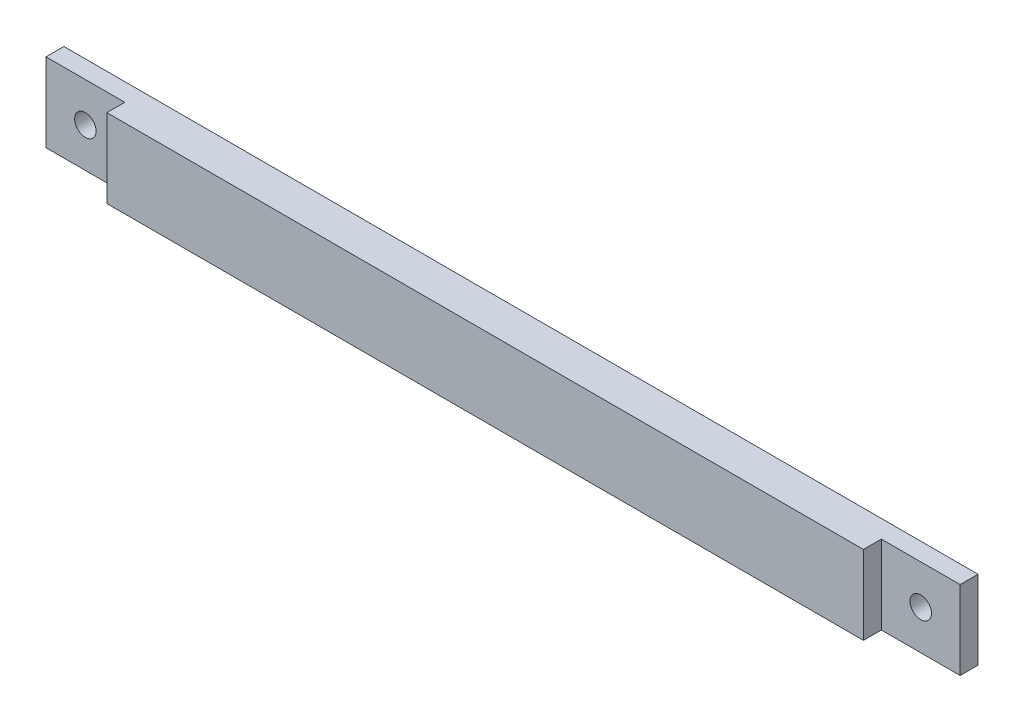
ISO-10303-21;
HEADER;
FILE_DESCRIPTION(('STEP AP214'),'2;1');
FILE_NAME('part.step','',(''),(''),'','','');
FILE_SCHEMA(('AUTOMOTIVE_DESIGN { 1 0 10303 214 1 1 1 1 }'));
ENDSEC;
DATA;
#1=APPLICATION_CONTEXT('core data for automotive mechanical design processes');
#2=APPLICATION_PROTOCOL_DEFINITION('international standard','automotive_design',2000,#1);
#3=PRODUCT_CONTEXT('',#1,'mechanical');
#4=PRODUCT('Part','Part','',(#3));
#5=PRODUCT_RELATED_PRODUCT_CATEGORY('part','',(#4));
#6=PRODUCT_DEFINITION_FORMATION('','',#4);
#7=PRODUCT_DEFINITION_CONTEXT('part definition',#1,'design');
#8=PRODUCT_DEFINITION('design','',#6,#7);
#9=PRODUCT_DEFINITION_SHAPE('','',#8);
#10=(LENGTH_UNIT() NAMED_UNIT(*) SI_UNIT(.MILLI.,.METRE.));
#11=(NAMED_UNIT(*) PLANE_ANGLE_UNIT() SI_UNIT($,.RADIAN.));
#12=(NAMED_UNIT(*) SI_UNIT($,.STERADIAN.) SOLID_ANGLE_UNIT());
#13=UNCERTAINTY_MEASURE_WITH_UNIT(LENGTH_MEASURE(1.E-05),#10,'distance_accuracy_value','');
#14=(GEOMETRIC_REPRESENTATION_CONTEXT(3) GLOBAL_UNCERTAINTY_ASSIGNED_CONTEXT((#13)) GLOBAL_UNIT_ASSIGNED_CONTEXT((#10,
#11,#12)) REPRESENTATION_CONTEXT('',''));
#15=CARTESIAN_POINT('',(0.,0.,0.));
#16=DIRECTION('',(0.,0.,1.));
#17=DIRECTION('',(1.,0.,0.));
#18=AXIS2_PLACEMENT_3D('',#15,#16,#17);
#19=CARTESIAN_POINT('',(-86.4390315350308,33.5175790615968,10.));
#20=DIRECTION('',(1.,0.,0.));
#21=DIRECTION('',(0.,1.,0.));
#22=AXIS2_PLACEMENT_3D('',#19,#20,#21);
#23=PLANE('',#22);
#24=DIRECTION('',(0.,-1.,0.));
#25=VECTOR('',#24,1.);
#26=CARTESIAN_POINT('',(-86.4390315350308,33.5175790615968,5.));
#27=LINE('',#26,#25);
#28=CARTESIAN_POINT('',(-86.4390315350308,33.5175790615968,5.));
#29=VERTEX_POINT('',#28);
#30=CARTESIAN_POINT('',(-86.4390315350308,11.5175790615968,5.));
#31=VERTEX_POINT('',#30);
#32=EDGE_CURVE('E105',#29,#31,#27,.T.);
#33=ORIENTED_EDGE('',*,*,#32,.F.);
#34=DIRECTION('',(0.,0.,-1.));
#35=VECTOR('',#34,1.);
#36=CARTESIAN_POINT('',(-86.4390315350308,33.5175790615968,10.));
#37=LINE('',#36,#35);
#38=CARTESIAN_POINT('',(-86.4390315350308,33.5175790615968,0.));
#39=VERTEX_POINT('',#38);
#40=EDGE_CURVE('E127',#29,#39,#37,.T.);
#41=ORIENTED_EDGE('',*,*,#40,.T.);
#42=DIRECTION('',(0.,-1.,0.));
#43=VECTOR('',#42,1.);
#44=CARTESIAN_POINT('',(-86.4390315350308,33.5175790615968,0.));
#45=LINE('',#44,#43);
#46=CARTESIAN_POINT('',(-86.4390315350308,11.5175790615968,0.));
#47=VERTEX_POINT('',#46);
#48=EDGE_CURVE('E126',#39,#47,#45,.T.);
#49=ORIENTED_EDGE('',*,*,#48,.T.);
#50=DIRECTION('',(0.,0.,-1.));
#51=VECTOR('',#50,1.);
#52=CARTESIAN_POINT('',(-86.4390315350308,11.5175790615968,10.));
#53=LINE('',#52,#51);
#54=EDGE_CURVE('E11',#31,#47,#53,.T.);
#55=ORIENTED_EDGE('',*,*,#54,.F.);
#56=EDGE_LOOP('',(#33,#41,#49,#55));
#57=FACE_BOUND('',#56,.T.);
#58=ADVANCED_FACE('F40',(#57),#23,.F.);
#59=CARTESIAN_POINT('',(-75.4390315350308,22.5175790615969,10.));
#60=DIRECTION('',(0.,0.,-1.));
#61=DIRECTION('',(-1.,0.,0.));
#62=AXIS2_PLACEMENT_3D('',#59,#60,#61);
#63=CYLINDRICAL_SURFACE('',#62,3.00000000000001);
#64=CARTESIAN_POINT('',(-75.4390315350308,22.5175790615969,0.));
#65=DIRECTION('',(0.,0.,1.));
#66=DIRECTION('',(1.,0.,0.));
#67=AXIS2_PLACEMENT_3D('',#64,#65,#66);
#68=CIRCLE('',#67,3.00000000000001);
#69=CARTESIAN_POINT('',(-72.4390315350308,22.5175790615969,0.));
#70=VERTEX_POINT('',#69);
#71=EDGE_CURVE('E132',#70,#70,#68,.T.);
#72=ORIENTED_EDGE('',*,*,#71,.F.);
#73=EDGE_LOOP('',(#72));
#74=FACE_BOUND('',#73,.T.);
#75=CARTESIAN_POINT('',(-75.4390315350308,22.5175790615969,5.));
#76=DIRECTION('',(0.,0.,1.));
#77=DIRECTION('',(1.,0.,0.));
#78=AXIS2_PLACEMENT_3D('',#75,#76,#77);
#79=CIRCLE('',#78,3.00000000000001);
#80=CARTESIAN_POINT('',(-72.4390315350308,22.5175790615969,5.));
#81=VERTEX_POINT('',#80);
#82=EDGE_CURVE('E151',#81,#81,#79,.T.);
#83=ORIENTED_EDGE('',*,*,#82,.T.);
#84=EDGE_LOOP('',(#83));
#85=FACE_BOUND('',#84,.T.);
#86=ADVANCED_FACE('F212',(#74,#85),#63,.F.);
#87=CARTESIAN_POINT('',(-86.4390315350308,11.5175790615968,10.));
#88=DIRECTION('',(0.,1.,0.));
#89=DIRECTION('',(0.,0.,1.));
#90=AXIS2_PLACEMENT_3D('',#87,#88,#89);
#91=PLANE('',#90);
#92=DIRECTION('',(1.,0.,0.));
#93=VECTOR('',#92,1.);
#94=CARTESIAN_POINT('',(-86.4390315350308,11.5175790615968,10.));
#95=LINE('',#94,#93);
#96=CARTESIAN_POINT('',(-64.4390315350309,11.5175790615968,10.));
#97=VERTEX_POINT('',#96);
#98=CARTESIAN_POINT('',(146.910968464969,11.5175790615968,10.));
#99=VERTEX_POINT('',#98);
#100=EDGE_CURVE('E147',#97,#99,#95,.T.);
#101=ORIENTED_EDGE('',*,*,#100,.F.);
#102=DIRECTION('',(0.,0.,1.));
#103=VECTOR('',#102,1.);
#104=CARTESIAN_POINT('',(-64.4390315350309,11.5175790615968,5.));
#105=LINE('',#104,#103);
#106=CARTESIAN_POINT('',(-64.4390315350309,11.5175790615968,5.));
#107=VERTEX_POINT('',#106);
#108=EDGE_CURVE('E64',#107,#97,#105,.T.);
#109=ORIENTED_EDGE('',*,*,#108,.F.);
#110=DIRECTION('',(1.,0.,0.));
#111=VECTOR('',#110,1.);
#112=CARTESIAN_POINT('',(-86.4390315350308,11.5175790615968,5.));
#113=LINE('',#112,#111);
#114=EDGE_CURVE('E109',#31,#107,#113,.T.);
#115=ORIENTED_EDGE('',*,*,#114,.F.);
#116=ORIENTED_EDGE('',*,*,#54,.T.);
#117=DIRECTION('',(1.,0.,0.));
#118=VECTOR('',#117,1.);
#119=CARTESIAN_POINT('',(-86.4390315350308,11.5175790615968,0.));
#120=LINE('',#119,#118);
#121=CARTESIAN_POINT('',(168.910968464969,11.5175790615968,0.));
#122=VERTEX_POINT('',#121);
#123=EDGE_CURVE('E131',#47,#122,#120,.T.);
#124=ORIENTED_EDGE('',*,*,#123,.T.);
#125=DIRECTION('',(0.,0.,-1.));
#126=VECTOR('',#125,1.);
#127=CARTESIAN_POINT('',(168.910968464969,11.5175790615968,10.));
#128=LINE('',#127,#126);
#129=CARTESIAN_POINT('',(168.910968464969,11.5175790615968,5.));
#130=VERTEX_POINT('',#129);
#131=EDGE_CURVE('E48',#130,#122,#128,.T.);
#132=ORIENTED_EDGE('',*,*,#131,.F.);
#133=DIRECTION('',(1.,0.,0.));
#134=VECTOR('',#133,1.);
#135=CARTESIAN_POINT('',(168.910968464969,11.5175790615968,5.));
#136=LINE('',#135,#134);
#137=CARTESIAN_POINT('',(146.910968464969,11.5175790615968,5.));
#138=VERTEX_POINT('',#137);
#139=EDGE_CURVE('E167',#138,#130,#136,.T.);
#140=ORIENTED_EDGE('',*,*,#139,.F.);
#141=DIRECTION('',(0.,0.,1.));
#142=VECTOR('',#141,1.);
#143=CARTESIAN_POINT('',(146.910968464969,11.5175790615968,5.));
#144=LINE('',#143,#142);
#145=EDGE_CURVE('E168',#138,#99,#144,.T.);
#146=ORIENTED_EDGE('',*,*,#145,.T.);
#147=EDGE_LOOP('',(#101,#109,#115,#116,#124,#132,#140,#146));
#148=FACE_BOUND('',#147,.T.);
#149=ADVANCED_FACE('F119',(#148),#91,.F.);
#150=CARTESIAN_POINT('',(168.910968464969,33.5175790615968,10.));
#151=DIRECTION('',(-1.,0.,0.));
#152=DIRECTION('',(0.,0.,1.));
#153=AXIS2_PLACEMENT_3D('',#150,#151,#152);
#154=PLANE('',#153);
#155=DIRECTION('',(0.,0.,-1.));
#156=VECTOR('',#155,1.);
#157=CARTESIAN_POINT('',(168.910968464969,33.5175790615968,10.));
#158=LINE('',#157,#156);
#159=CARTESIAN_POINT('',(168.910968464969,33.5175790615968,5.));
#160=VERTEX_POINT('',#159);
#161=CARTESIAN_POINT('',(168.910968464969,33.5175790615968,0.));
#162=VERTEX_POINT('',#161);
#163=EDGE_CURVE('E149',#160,#162,#158,.T.);
#164=ORIENTED_EDGE('',*,*,#163,.F.);
#165=DIRECTION('',(0.,1.,0.));
#166=VECTOR('',#165,1.);
#167=CARTESIAN_POINT('',(168.910968464969,33.5175790615968,5.));
#168=LINE('',#167,#166);
#169=EDGE_CURVE('E173',#130,#160,#168,.T.);
#170=ORIENTED_EDGE('',*,*,#169,.F.);
#171=ORIENTED_EDGE('',*,*,#131,.T.);
#172=DIRECTION('',(0.,1.,0.));
#173=VECTOR('',#172,1.);
#174=CARTESIAN_POINT('',(168.910968464969,33.5175790615968,0.));
#175=LINE('',#174,#173);
#176=EDGE_CURVE('E134',#122,#162,#175,.T.);
#177=ORIENTED_EDGE('',*,*,#176,.T.);
#178=EDGE_LOOP('',(#164,#170,#171,#177));
#179=FACE_BOUND('',#178,.T.);
#180=ADVANCED_FACE('F192',(#179),#154,.F.);
#181=CARTESIAN_POINT('',(-86.4390315350308,33.5175790615968,10.));
#182=DIRECTION('',(0.,-1.,0.));
#183=DIRECTION('',(0.,0.,-1.));
#184=AXIS2_PLACEMENT_3D('',#181,#182,#183);
#185=PLANE('',#184);
#186=DIRECTION('',(-1.,0.,0.));
#187=VECTOR('',#186,1.);
#188=CARTESIAN_POINT('',(-86.4390315350308,33.5175790615968,5.));
#189=LINE('',#188,#187);
#190=CARTESIAN_POINT('',(-64.4390315350309,33.5175790615968,5.));
#191=VERTEX_POINT('',#190);
#192=EDGE_CURVE('E111',#191,#29,#189,.T.);
#193=ORIENTED_EDGE('',*,*,#192,.F.);
#194=DIRECTION('',(0.,0.,1.));
#195=VECTOR('',#194,1.);
#196=CARTESIAN_POINT('',(-64.4390315350309,33.5175790615968,5.));
#197=LINE('',#196,#195);
#198=CARTESIAN_POINT('',(-64.4390315350309,33.5175790615968,10.));
#199=VERTEX_POINT('',#198);
#200=EDGE_CURVE('E153',#191,#199,#197,.T.);
#201=ORIENTED_EDGE('',*,*,#200,.T.);
#202=DIRECTION('',(-1.,0.,0.));
#203=VECTOR('',#202,1.);
#204=CARTESIAN_POINT('',(-86.4390315350308,33.5175790615968,10.));
#205=LINE('',#204,#203);
#206=CARTESIAN_POINT('',(146.910968464969,33.5175790615968,10.));
#207=VERTEX_POINT('',#206);
#208=EDGE_CURVE('E140',#207,#199,#205,.T.);
#209=ORIENTED_EDGE('',*,*,#208,.F.);
#210=DIRECTION('',(0.,0.,1.));
#211=VECTOR('',#210,1.);
#212=CARTESIAN_POINT('',(146.910968464969,33.5175790615969,5.));
#213=LINE('',#212,#211);
#214=CARTESIAN_POINT('',(146.910968464969,33.5175790615969,5.));
#215=VERTEX_POINT('',#214);
#216=EDGE_CURVE('E56',#215,#207,#213,.T.);
#217=ORIENTED_EDGE('',*,*,#216,.F.);
#218=DIRECTION('',(-1.,0.,0.));
#219=VECTOR('',#218,1.);
#220=CARTESIAN_POINT('',(168.910968464969,33.5175790615968,5.));
#221=LINE('',#220,#219);
#222=EDGE_CURVE('E178',#160,#215,#221,.T.);
#223=ORIENTED_EDGE('',*,*,#222,.F.);
#224=ORIENTED_EDGE('',*,*,#163,.T.);
#225=DIRECTION('',(-1.,0.,0.));
#226=VECTOR('',#225,1.);
#227=CARTESIAN_POINT('',(-86.4390315350308,33.5175790615968,0.));
#228=LINE('',#227,#226);
#229=EDGE_CURVE('E145',#162,#39,#228,.T.);
#230=ORIENTED_EDGE('',*,*,#229,.T.);
#231=ORIENTED_EDGE('',*,*,#40,.F.);
#232=EDGE_LOOP('',(#193,#201,#209,#217,#223,#224,#230,#231));
#233=FACE_BOUND('',#232,.T.);
#234=ADVANCED_FACE('F186',(#233),#185,.F.);
#235=CARTESIAN_POINT('',(0.,0.,10.));
#236=DIRECTION('',(0.,0.,1.));
#237=DIRECTION('',(1.,0.,0.));
#238=AXIS2_PLACEMENT_3D('',#235,#236,#237);
#239=PLANE('',#238);
#240=DIRECTION('',(0.,1.,0.));
#241=VECTOR('',#240,1.);
#242=CARTESIAN_POINT('',(-64.4390315350309,33.5175790615968,10.));
#243=LINE('',#242,#241);
#244=EDGE_CURVE('E115',#97,#199,#243,.T.);
#245=ORIENTED_EDGE('',*,*,#244,.F.);
#246=ORIENTED_EDGE('',*,*,#100,.T.);
#247=DIRECTION('',(0.,-1.,0.));
#248=VECTOR('',#247,1.);
#249=CARTESIAN_POINT('',(146.910968464969,33.5175790615969,10.));
#250=LINE('',#249,#248);
#251=EDGE_CURVE('E171',#207,#99,#250,.T.);
#252=ORIENTED_EDGE('',*,*,#251,.F.);
#253=ORIENTED_EDGE('',*,*,#208,.T.);
#254=EDGE_LOOP('',(#245,#246,#252,#253));
#255=FACE_BOUND('',#254,.T.);
#256=ADVANCED_FACE('F185',(#255),#239,.T.);
#257=CARTESIAN_POINT('',(0.,0.,0.));
#258=DIRECTION('',(0.,0.,1.));
#259=DIRECTION('',(1.,0.,0.));
#260=AXIS2_PLACEMENT_3D('',#257,#258,#259);
#261=PLANE('',#260);
#262=ORIENTED_EDGE('',*,*,#71,.T.);
#263=EDGE_LOOP('',(#262));
#264=FACE_BOUND('',#263,.T.);
#265=CARTESIAN_POINT('',(157.910968464969,22.5175790615969,0.));
#266=DIRECTION('',(0.,0.,1.));
#267=DIRECTION('',(1.,0.,0.));
#268=AXIS2_PLACEMENT_3D('',#265,#266,#267);
#269=CIRCLE('',#268,2.99999999999999);
#270=CARTESIAN_POINT('',(160.910968464969,22.5175790615969,0.));
#271=VERTEX_POINT('',#270);
#272=EDGE_CURVE('E137',#271,#271,#269,.T.);
#273=ORIENTED_EDGE('',*,*,#272,.T.);
#274=EDGE_LOOP('',(#273));
#275=FACE_BOUND('',#274,.T.);
#276=ORIENTED_EDGE('',*,*,#48,.F.);
#277=ORIENTED_EDGE('',*,*,#229,.F.);
#278=ORIENTED_EDGE('',*,*,#176,.F.);
#279=ORIENTED_EDGE('',*,*,#123,.F.);
#280=EDGE_LOOP('',(#276,#277,#278,#279));
#281=FACE_BOUND('',#280,.T.);
#282=ADVANCED_FACE('F195',(#264,#275,#281),#261,.F.);
#283=CARTESIAN_POINT('',(157.910968464969,22.5175790615969,10.));
#284=DIRECTION('',(0.,0.,-1.));
#285=DIRECTION('',(-1.,0.,0.));
#286=AXIS2_PLACEMENT_3D('',#283,#284,#285);
#287=CYLINDRICAL_SURFACE('',#286,2.99999999999999);
#288=CARTESIAN_POINT('',(157.910968464969,22.5175790615969,5.));
#289=DIRECTION('',(0.,0.,-1.));
#290=DIRECTION('',(-1.,0.,0.));
#291=AXIS2_PLACEMENT_3D('',#288,#289,#290);
#292=CIRCLE('',#291,2.99999999999999);
#293=CARTESIAN_POINT('',(154.910968464969,22.5175790615969,5.));
#294=VERTEX_POINT('',#293);
#295=EDGE_CURVE('E43',#294,#294,#292,.T.);
#296=ORIENTED_EDGE('',*,*,#295,.F.);
#297=EDGE_LOOP('',(#296));
#298=FACE_BOUND('',#297,.T.);
#299=ORIENTED_EDGE('',*,*,#272,.F.);
#300=EDGE_LOOP('',(#299));
#301=FACE_BOUND('',#300,.T.);
#302=ADVANCED_FACE('F199',(#298,#301),#287,.F.);
#303=CARTESIAN_POINT('',(-64.4390315350309,33.5175790615968,5.));
#304=DIRECTION('',(1.,0.,0.));
#305=DIRECTION('',(0.,0.,-1.));
#306=AXIS2_PLACEMENT_3D('',#303,#304,#305);
#307=PLANE('',#306);
#308=ORIENTED_EDGE('',*,*,#244,.T.);
#309=ORIENTED_EDGE('',*,*,#200,.F.);
#310=DIRECTION('',(0.,1.,0.));
#311=VECTOR('',#310,1.);
#312=CARTESIAN_POINT('',(-64.4390315350309,33.5175790615968,5.));
#313=LINE('',#312,#311);
#314=EDGE_CURVE('E122',#107,#191,#313,.T.);
#315=ORIENTED_EDGE('',*,*,#314,.F.);
#316=ORIENTED_EDGE('',*,*,#108,.T.);
#317=EDGE_LOOP('',(#308,#309,#315,#316));
#318=FACE_BOUND('',#317,.T.);
#319=ADVANCED_FACE('F197',(#318),#307,.F.);
#320=CARTESIAN_POINT('',(0.,0.,5.));
#321=DIRECTION('',(0.,0.,1.));
#322=DIRECTION('',(1.,0.,0.));
#323=AXIS2_PLACEMENT_3D('',#320,#321,#322);
#324=PLANE('',#323);
#325=ORIENTED_EDGE('',*,*,#82,.F.);
#326=EDGE_LOOP('',(#325));
#327=FACE_BOUND('',#326,.T.);
#328=ORIENTED_EDGE('',*,*,#32,.T.);
#329=ORIENTED_EDGE('',*,*,#114,.T.);
#330=ORIENTED_EDGE('',*,*,#314,.T.);
#331=ORIENTED_EDGE('',*,*,#192,.T.);
#332=EDGE_LOOP('',(#328,#329,#330,#331));
#333=FACE_BOUND('',#332,.T.);
#334=ADVANCED_FACE('F107',(#327,#333),#324,.T.);
#335=CARTESIAN_POINT('',(146.910968464969,33.5175790615969,5.));
#336=DIRECTION('',(-1.,0.,0.));
#337=DIRECTION('',(0.,-1.,0.));
#338=AXIS2_PLACEMENT_3D('',#335,#336,#337);
#339=PLANE('',#338);
#340=ORIENTED_EDGE('',*,*,#251,.T.);
#341=ORIENTED_EDGE('',*,*,#145,.F.);
#342=DIRECTION('',(0.,-1.,0.));
#343=VECTOR('',#342,1.);
#344=CARTESIAN_POINT('',(146.910968464969,33.5175790615969,5.));
#345=LINE('',#344,#343);
#346=EDGE_CURVE('E175',#215,#138,#345,.T.);
#347=ORIENTED_EDGE('',*,*,#346,.F.);
#348=ORIENTED_EDGE('',*,*,#216,.T.);
#349=EDGE_LOOP('',(#340,#341,#347,#348));
#350=FACE_BOUND('',#349,.T.);
#351=ADVANCED_FACE('F205',(#350),#339,.F.);
#352=CARTESIAN_POINT('',(0.,0.,5.));
#353=DIRECTION('',(0.,0.,-1.));
#354=DIRECTION('',(-1.,0.,0.));
#355=AXIS2_PLACEMENT_3D('',#352,#353,#354);
#356=PLANE('',#355);
#357=ORIENTED_EDGE('',*,*,#295,.T.);
#358=EDGE_LOOP('',(#357));
#359=FACE_BOUND('',#358,.T.);
#360=ORIENTED_EDGE('',*,*,#169,.T.);
#361=ORIENTED_EDGE('',*,*,#222,.T.);
#362=ORIENTED_EDGE('',*,*,#346,.T.);
#363=ORIENTED_EDGE('',*,*,#139,.T.);
#364=EDGE_LOOP('',(#360,#361,#362,#363));
#365=FACE_BOUND('',#364,.T.);
#366=ADVANCED_FACE('F224',(#359,#365),#356,.F.);
#367=CLOSED_SHELL('',(#58,#86,#149,#180,#234,#256,#282,#302,#319,#334,#351,#366));
#368=MANIFOLD_SOLID_BREP('B2',#367);
#369=ADVANCED_BREP_SHAPE_REPRESENTATION('',(#18,#368),#14);
#370=SHAPE_DEFINITION_REPRESENTATION(#9,#369);
ENDSEC;
END-ISO-10303-21;
